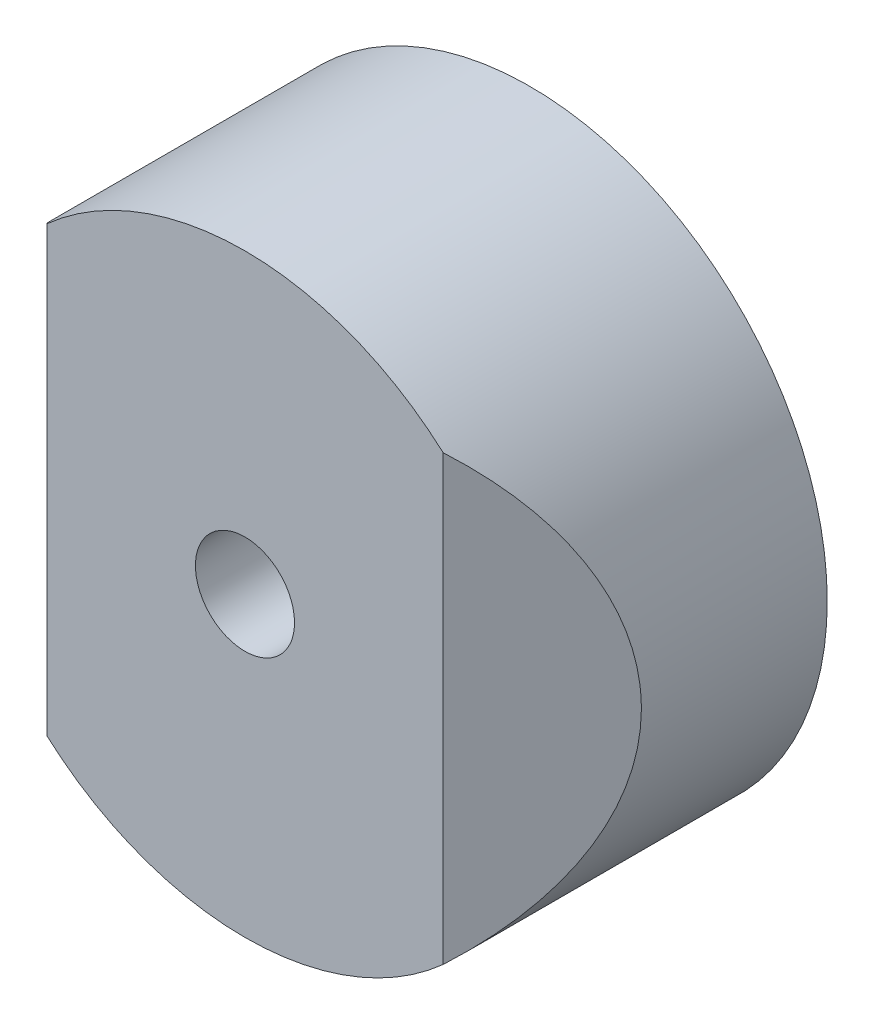
ISO-10303-21;
HEADER;
FILE_DESCRIPTION(('STEP AP214'),'2;1');
FILE_NAME('part.step','',(''),(''),'','','');
FILE_SCHEMA(('AUTOMOTIVE_DESIGN { 1 0 10303 214 1 1 1 1 }'));
ENDSEC;
DATA;
#1=APPLICATION_CONTEXT('core data for automotive mechanical design processes');
#2=APPLICATION_PROTOCOL_DEFINITION('international standard','automotive_design',2000,#1);
#3=PRODUCT_CONTEXT('',#1,'mechanical');
#4=PRODUCT('Part','Part','',(#3));
#5=PRODUCT_RELATED_PRODUCT_CATEGORY('part','',(#4));
#6=PRODUCT_DEFINITION_FORMATION('','',#4);
#7=PRODUCT_DEFINITION_CONTEXT('part definition',#1,'design');
#8=PRODUCT_DEFINITION('design','',#6,#7);
#9=PRODUCT_DEFINITION_SHAPE('','',#8);
#10=(LENGTH_UNIT() NAMED_UNIT(*) SI_UNIT(.MILLI.,.METRE.));
#11=(NAMED_UNIT(*) PLANE_ANGLE_UNIT() SI_UNIT($,.RADIAN.));
#12=(NAMED_UNIT(*) SI_UNIT($,.STERADIAN.) SOLID_ANGLE_UNIT());
#13=UNCERTAINTY_MEASURE_WITH_UNIT(LENGTH_MEASURE(1.E-05),#10,'distance_accuracy_value','');
#14=(GEOMETRIC_REPRESENTATION_CONTEXT(3) GLOBAL_UNCERTAINTY_ASSIGNED_CONTEXT((#13)) GLOBAL_UNIT_ASSIGNED_CONTEXT((#10,
#11,#12)) REPRESENTATION_CONTEXT('',''));
#15=CARTESIAN_POINT('',(0.,0.,0.));
#16=DIRECTION('',(0.,0.,1.));
#17=DIRECTION('',(1.,0.,0.));
#18=AXIS2_PLACEMENT_3D('',#15,#16,#17);
#19=CARTESIAN_POINT('',(0.,0.,-36.5125));
#20=DIRECTION('',(0.,0.,1.));
#21=DIRECTION('',(1.,0.,0.));
#22=AXIS2_PLACEMENT_3D('',#19,#20,#21);
#23=CYLINDRICAL_SURFACE('',#22,38.1);
#24=CARTESIAN_POINT('',(0.,0.,25.3999999999998));
#25=DIRECTION('',(0.707106781186546,0.,-0.707106781186549));
#26=DIRECTION('',(0.707106781186549,0.,0.707106781186546));
#27=AXIS2_PLACEMENT_3D('',#24,#25,#26);
#28=ELLIPSE('',#27,53.8815367264148,38.1);
#29=CARTESIAN_POINT('',(-25.3999999999999,28.3980633142473,0.));
#30=VERTEX_POINT('',#29);
#31=CARTESIAN_POINT('',(-25.3999999999999,-28.3980633142474,0.));
#32=VERTEX_POINT('',#31);
#33=EDGE_CURVE('E45',#30,#32,#28,.F.);
#34=ORIENTED_EDGE('',*,*,#33,.F.);
#35=CARTESIAN_POINT('',(0.,0.,0.));
#36=DIRECTION('',(0.,0.,1.));
#37=DIRECTION('',(1.,0.,0.));
#38=AXIS2_PLACEMENT_3D('',#35,#36,#37);
#39=CIRCLE('',#38,38.1);
#40=CARTESIAN_POINT('',(25.3999999999999,28.3980633142474,0.));
#41=VERTEX_POINT('',#40);
#42=EDGE_CURVE('E67',#41,#30,#39,.T.);
#43=ORIENTED_EDGE('',*,*,#42,.F.);
#44=CARTESIAN_POINT('',(0.,0.,25.3999999999998));
#45=DIRECTION('',(-0.707106781186546,0.,-0.707106781186549));
#46=DIRECTION('',(-0.707106781186549,0.,0.707106781186546));
#47=AXIS2_PLACEMENT_3D('',#44,#45,#46);
#48=ELLIPSE('',#47,53.8815367264148,38.1);
#49=CARTESIAN_POINT('',(25.3999999999999,-28.3980633142474,0.));
#50=VERTEX_POINT('',#49);
#51=EDGE_CURVE('E52',#50,#41,#48,.F.);
#52=ORIENTED_EDGE('',*,*,#51,.F.);
#53=EDGE_CURVE('E66',#32,#50,#39,.T.);
#54=ORIENTED_EDGE('',*,*,#53,.F.);
#55=EDGE_LOOP('',(#34,#43,#52,#54));
#56=FACE_BOUND('',#55,.T.);
#57=CARTESIAN_POINT('',(0.,0.,-36.5125));
#58=DIRECTION('',(0.,0.,1.));
#59=DIRECTION('',(1.,0.,0.));
#60=AXIS2_PLACEMENT_3D('',#57,#58,#59);
#61=CIRCLE('',#60,38.1);
#62=CARTESIAN_POINT('',(38.1,0.,-36.5125));
#63=VERTEX_POINT('',#62);
#64=EDGE_CURVE('E62',#63,#63,#61,.T.);
#65=ORIENTED_EDGE('',*,*,#64,.T.);
#66=EDGE_LOOP('',(#65));
#67=FACE_BOUND('',#66,.T.);
#68=ADVANCED_FACE('F33',(#56,#67),#23,.T.);
#69=CARTESIAN_POINT('',(0.,0.,-36.5125));
#70=DIRECTION('',(0.,0.,1.));
#71=DIRECTION('',(1.,0.,0.));
#72=AXIS2_PLACEMENT_3D('',#69,#70,#71);
#73=PLANE('',#72);
#74=CARTESIAN_POINT('',(0.,0.,-36.5125));
#75=DIRECTION('',(0.,0.,1.));
#76=DIRECTION('',(1.,0.,0.));
#77=AXIS2_PLACEMENT_3D('',#74,#75,#76);
#78=CIRCLE('',#77,6.35);
#79=CARTESIAN_POINT('',(6.35,0.,-36.5125));
#80=VERTEX_POINT('',#79);
#81=EDGE_CURVE('E71',#80,#80,#78,.T.);
#82=ORIENTED_EDGE('',*,*,#81,.T.);
#83=EDGE_LOOP('',(#82));
#84=FACE_BOUND('',#83,.T.);
#85=ORIENTED_EDGE('',*,*,#64,.F.);
#86=EDGE_LOOP('',(#85));
#87=FACE_BOUND('',#86,.T.);
#88=ADVANCED_FACE('F85',(#84,#87),#73,.F.);
#89=CARTESIAN_POINT('',(0.,0.,0.));
#90=DIRECTION('',(0.,0.,1.));
#91=DIRECTION('',(1.,0.,0.));
#92=AXIS2_PLACEMENT_3D('',#89,#90,#91);
#93=PLANE('',#92);
#94=DIRECTION('',(0.,1.,0.));
#95=VECTOR('',#94,1.);
#96=CARTESIAN_POINT('',(-25.3999999999999,0.,0.));
#97=LINE('',#96,#95);
#98=EDGE_CURVE('E11',#32,#30,#97,.T.);
#99=ORIENTED_EDGE('',*,*,#98,.F.);
#100=ORIENTED_EDGE('',*,*,#53,.T.);
#101=DIRECTION('',(0.,-1.,0.));
#102=VECTOR('',#101,1.);
#103=CARTESIAN_POINT('',(25.3999999999999,0.,0.));
#104=LINE('',#103,#102);
#105=EDGE_CURVE('E40',#41,#50,#104,.T.);
#106=ORIENTED_EDGE('',*,*,#105,.F.);
#107=ORIENTED_EDGE('',*,*,#42,.T.);
#108=EDGE_LOOP('',(#99,#100,#106,#107));
#109=FACE_BOUND('',#108,.T.);
#110=CARTESIAN_POINT('',(0.,0.,0.));
#111=DIRECTION('',(0.,0.,1.));
#112=DIRECTION('',(1.,0.,0.));
#113=AXIS2_PLACEMENT_3D('',#110,#111,#112);
#114=CIRCLE('',#113,6.35);
#115=CARTESIAN_POINT('',(6.35,0.,0.));
#116=VERTEX_POINT('',#115);
#117=EDGE_CURVE('E74',#116,#116,#114,.T.);
#118=ORIENTED_EDGE('',*,*,#117,.F.);
#119=EDGE_LOOP('',(#118));
#120=FACE_BOUND('',#119,.T.);
#121=ADVANCED_FACE('F69',(#109,#120),#93,.T.);
#122=CARTESIAN_POINT('',(0.,0.,-36.5125));
#123=DIRECTION('',(0.,0.,1.));
#124=DIRECTION('',(1.,0.,0.));
#125=AXIS2_PLACEMENT_3D('',#122,#123,#124);
#126=CYLINDRICAL_SURFACE('',#125,6.35);
#127=ORIENTED_EDGE('',*,*,#81,.F.);
#128=EDGE_LOOP('',(#127));
#129=FACE_BOUND('',#128,.T.);
#130=ORIENTED_EDGE('',*,*,#117,.T.);
#131=EDGE_LOOP('',(#130));
#132=FACE_BOUND('',#131,.T.);
#133=ADVANCED_FACE('F83',(#129,#132),#126,.F.);
#134=CARTESIAN_POINT('',(38.1,-38.1,-12.7));
#135=DIRECTION('',(-0.707106781186546,0.,-0.707106781186549));
#136=DIRECTION('',(-0.707106781186549,0.,0.707106781186546));
#137=AXIS2_PLACEMENT_3D('',#134,#135,#136);
#138=PLANE('',#137);
#139=ORIENTED_EDGE('',*,*,#51,.T.);
#140=ORIENTED_EDGE('',*,*,#105,.T.);
#141=EDGE_LOOP('',(#139,#140));
#142=FACE_BOUND('',#141,.T.);
#143=ADVANCED_FACE('F57',(#142),#138,.F.);
#144=CARTESIAN_POINT('',(-38.1,-38.1,-12.7));
#145=DIRECTION('',(0.707106781186546,0.,-0.707106781186549));
#146=DIRECTION('',(-0.707106781186549,0.,-0.707106781186546));
#147=AXIS2_PLACEMENT_3D('',#144,#145,#146);
#148=PLANE('',#147);
#149=ORIENTED_EDGE('',*,*,#33,.T.);
#150=ORIENTED_EDGE('',*,*,#98,.T.);
#151=EDGE_LOOP('',(#149,#150));
#152=FACE_BOUND('',#151,.T.);
#153=ADVANCED_FACE('F117',(#152),#148,.F.);
#154=CLOSED_SHELL('',(#68,#88,#121,#133,#143,#153));
#155=MANIFOLD_SOLID_BREP('B2',#154);
#156=ADVANCED_BREP_SHAPE_REPRESENTATION('',(#18,#155),#14);
#157=SHAPE_DEFINITION_REPRESENTATION(#9,#156);
ENDSEC;
END-ISO-10303-21;
